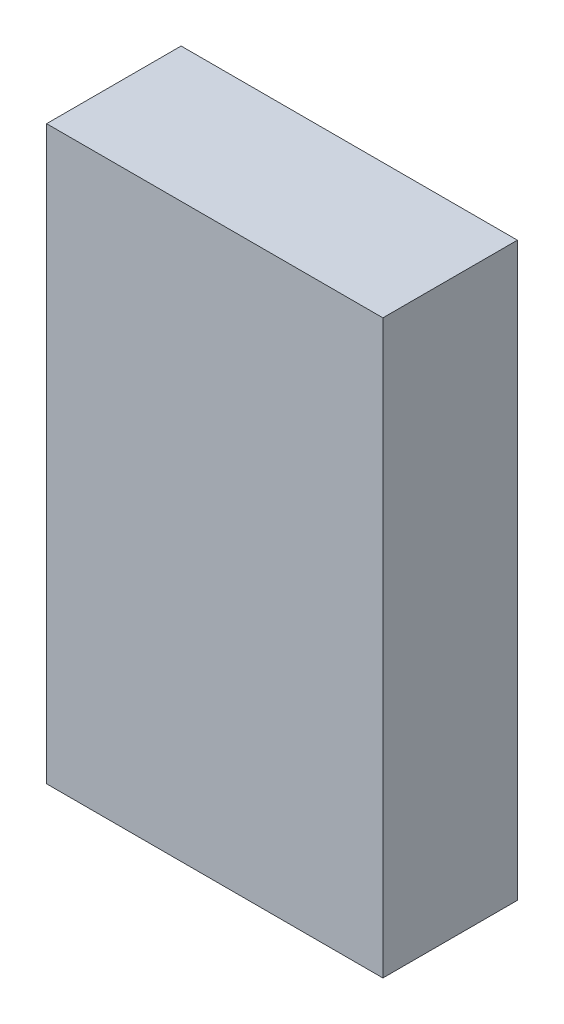
ISO-10303-21;
HEADER;
FILE_DESCRIPTION(('STEP AP214'),'2;1');
FILE_NAME('part.step','',(''),(''),'','','');
FILE_SCHEMA(('AUTOMOTIVE_DESIGN { 1 0 10303 214 1 1 1 1 }'));
ENDSEC;
DATA;
#1=APPLICATION_CONTEXT('core data for automotive mechanical design processes');
#2=APPLICATION_PROTOCOL_DEFINITION('international standard','automotive_design',2000,#1);
#3=PRODUCT_CONTEXT('',#1,'mechanical');
#4=PRODUCT('Part','Part','',(#3));
#5=PRODUCT_RELATED_PRODUCT_CATEGORY('part','',(#4));
#6=PRODUCT_DEFINITION_FORMATION('','',#4);
#7=PRODUCT_DEFINITION_CONTEXT('part definition',#1,'design');
#8=PRODUCT_DEFINITION('design','',#6,#7);
#9=PRODUCT_DEFINITION_SHAPE('','',#8);
#10=(LENGTH_UNIT() NAMED_UNIT(*) SI_UNIT(.MILLI.,.METRE.));
#11=(NAMED_UNIT(*) PLANE_ANGLE_UNIT() SI_UNIT($,.RADIAN.));
#12=(NAMED_UNIT(*) SI_UNIT($,.STERADIAN.) SOLID_ANGLE_UNIT());
#13=UNCERTAINTY_MEASURE_WITH_UNIT(LENGTH_MEASURE(1.E-05),#10,'distance_accuracy_value','');
#14=(GEOMETRIC_REPRESENTATION_CONTEXT(3) GLOBAL_UNCERTAINTY_ASSIGNED_CONTEXT((#13)) GLOBAL_UNIT_ASSIGNED_CONTEXT((#10,
#11,#12)) REPRESENTATION_CONTEXT('',''));
#15=CARTESIAN_POINT('',(0.,0.,0.));
#16=DIRECTION('',(0.,0.,1.));
#17=DIRECTION('',(1.,0.,0.));
#18=AXIS2_PLACEMENT_3D('',#15,#16,#17);
#19=CARTESIAN_POINT('',(-25.4,86.36,-10.16));
#20=DIRECTION('',(1.,0.,0.));
#21=DIRECTION('',(0.,0.,-1.));
#22=AXIS2_PLACEMENT_3D('',#19,#20,#21);
#23=PLANE('',#22);
#24=DIRECTION('',(0.,0.,1.));
#25=VECTOR('',#24,1.);
#26=CARTESIAN_POINT('',(-25.4,0.,-10.16));
#27=LINE('',#26,#25);
#28=CARTESIAN_POINT('',(-25.4,0.,-10.16));
#29=VERTEX_POINT('',#28);
#30=CARTESIAN_POINT('',(-25.4,0.,10.16));
#31=VERTEX_POINT('',#30);
#32=EDGE_CURVE('E113',#29,#31,#27,.T.);
#33=ORIENTED_EDGE('',*,*,#32,.T.);
#34=DIRECTION('',(0.,-1.,0.));
#35=VECTOR('',#34,1.);
#36=CARTESIAN_POINT('',(-25.4,86.36,10.16));
#37=LINE('',#36,#35);
#38=CARTESIAN_POINT('',(-25.4,86.36,10.16));
#39=VERTEX_POINT('',#38);
#40=EDGE_CURVE('E11',#39,#31,#37,.T.);
#41=ORIENTED_EDGE('',*,*,#40,.F.);
#42=DIRECTION('',(0.,0.,1.));
#43=VECTOR('',#42,1.);
#44=CARTESIAN_POINT('',(-25.4,86.36,-10.16));
#45=LINE('',#44,#43);
#46=CARTESIAN_POINT('',(-25.4,86.36,-10.16));
#47=VERTEX_POINT('',#46);
#48=EDGE_CURVE('E95',#47,#39,#45,.T.);
#49=ORIENTED_EDGE('',*,*,#48,.F.);
#50=DIRECTION('',(0.,-1.,0.));
#51=VECTOR('',#50,1.);
#52=CARTESIAN_POINT('',(-25.4,86.36,-10.16));
#53=LINE('',#52,#51);
#54=EDGE_CURVE('E62',#47,#29,#53,.T.);
#55=ORIENTED_EDGE('',*,*,#54,.T.);
#56=EDGE_LOOP('',(#33,#41,#49,#55));
#57=FACE_BOUND('',#56,.T.);
#58=ADVANCED_FACE('F45',(#57),#23,.F.);
#59=CARTESIAN_POINT('',(-25.4,86.36,10.16));
#60=DIRECTION('',(0.,0.,-1.));
#61=DIRECTION('',(-1.,0.,0.));
#62=AXIS2_PLACEMENT_3D('',#59,#60,#61);
#63=PLANE('',#62);
#64=DIRECTION('',(1.,0.,0.));
#65=VECTOR('',#64,1.);
#66=CARTESIAN_POINT('',(-25.4,0.,10.16));
#67=LINE('',#66,#65);
#68=CARTESIAN_POINT('',(25.4,0.,10.16));
#69=VERTEX_POINT('',#68);
#70=EDGE_CURVE('E101',#31,#69,#67,.T.);
#71=ORIENTED_EDGE('',*,*,#70,.T.);
#72=DIRECTION('',(0.,-1.,0.));
#73=VECTOR('',#72,1.);
#74=CARTESIAN_POINT('',(25.4,86.36,10.16));
#75=LINE('',#74,#73);
#76=CARTESIAN_POINT('',(25.4,86.36,10.16));
#77=VERTEX_POINT('',#76);
#78=EDGE_CURVE('E54',#77,#69,#75,.T.);
#79=ORIENTED_EDGE('',*,*,#78,.F.);
#80=DIRECTION('',(1.,0.,0.));
#81=VECTOR('',#80,1.);
#82=CARTESIAN_POINT('',(-25.4,86.36,10.16));
#83=LINE('',#82,#81);
#84=EDGE_CURVE('E87',#39,#77,#83,.T.);
#85=ORIENTED_EDGE('',*,*,#84,.F.);
#86=ORIENTED_EDGE('',*,*,#40,.T.);
#87=EDGE_LOOP('',(#71,#79,#85,#86));
#88=FACE_BOUND('',#87,.T.);
#89=ADVANCED_FACE('F100',(#88),#63,.F.);
#90=CARTESIAN_POINT('',(25.4,86.36,-10.16));
#91=DIRECTION('',(1.,0.,0.));
#92=DIRECTION('',(0.,0.,-1.));
#93=AXIS2_PLACEMENT_3D('',#90,#91,#92);
#94=PLANE('',#93);
#95=DIRECTION('',(0.,0.,1.));
#96=VECTOR('',#95,1.);
#97=CARTESIAN_POINT('',(25.4,0.,-10.16));
#98=LINE('',#97,#96);
#99=CARTESIAN_POINT('',(25.4,0.,-10.16));
#100=VERTEX_POINT('',#99);
#101=EDGE_CURVE('E118',#100,#69,#98,.T.);
#102=ORIENTED_EDGE('',*,*,#101,.F.);
#103=DIRECTION('',(0.,-1.,0.));
#104=VECTOR('',#103,1.);
#105=CARTESIAN_POINT('',(25.4,86.36,-10.16));
#106=LINE('',#105,#104);
#107=CARTESIAN_POINT('',(25.4,86.36,-10.16));
#108=VERTEX_POINT('',#107);
#109=EDGE_CURVE('E76',#108,#100,#106,.T.);
#110=ORIENTED_EDGE('',*,*,#109,.F.);
#111=DIRECTION('',(0.,0.,1.));
#112=VECTOR('',#111,1.);
#113=CARTESIAN_POINT('',(25.4,86.36,-10.16));
#114=LINE('',#113,#112);
#115=EDGE_CURVE('E94',#108,#77,#114,.T.);
#116=ORIENTED_EDGE('',*,*,#115,.T.);
#117=ORIENTED_EDGE('',*,*,#78,.T.);
#118=EDGE_LOOP('',(#102,#110,#116,#117));
#119=FACE_BOUND('',#118,.T.);
#120=ADVANCED_FACE('F105',(#119),#94,.T.);
#121=CARTESIAN_POINT('',(-25.4,86.36,-10.16));
#122=DIRECTION('',(0.,0.,-1.));
#123=DIRECTION('',(-1.,0.,0.));
#124=AXIS2_PLACEMENT_3D('',#121,#122,#123);
#125=PLANE('',#124);
#126=DIRECTION('',(1.,0.,0.));
#127=VECTOR('',#126,1.);
#128=CARTESIAN_POINT('',(-25.4,0.,-10.16));
#129=LINE('',#128,#127);
#130=EDGE_CURVE('E121',#29,#100,#129,.T.);
#131=ORIENTED_EDGE('',*,*,#130,.F.);
#132=ORIENTED_EDGE('',*,*,#54,.F.);
#133=DIRECTION('',(1.,0.,0.));
#134=VECTOR('',#133,1.);
#135=CARTESIAN_POINT('',(-25.4,86.36,-10.16));
#136=LINE('',#135,#134);
#137=EDGE_CURVE('E107',#47,#108,#136,.T.);
#138=ORIENTED_EDGE('',*,*,#137,.T.);
#139=ORIENTED_EDGE('',*,*,#109,.T.);
#140=EDGE_LOOP('',(#131,#132,#138,#139));
#141=FACE_BOUND('',#140,.T.);
#142=ADVANCED_FACE('F131',(#141),#125,.T.);
#143=CARTESIAN_POINT('',(0.,86.36,0.));
#144=DIRECTION('',(0.,1.,0.));
#145=DIRECTION('',(0.,0.,1.));
#146=AXIS2_PLACEMENT_3D('',#143,#144,#145);
#147=PLANE('',#146);
#148=ORIENTED_EDGE('',*,*,#48,.T.);
#149=ORIENTED_EDGE('',*,*,#84,.T.);
#150=ORIENTED_EDGE('',*,*,#115,.F.);
#151=ORIENTED_EDGE('',*,*,#137,.F.);
#152=EDGE_LOOP('',(#148,#149,#150,#151));
#153=FACE_BOUND('',#152,.T.);
#154=ADVANCED_FACE('F91',(#153),#147,.T.);
#155=CARTESIAN_POINT('',(0.,0.,0.));
#156=DIRECTION('',(0.,1.,0.));
#157=DIRECTION('',(0.,0.,1.));
#158=AXIS2_PLACEMENT_3D('',#155,#156,#157);
#159=PLANE('',#158);
#160=ORIENTED_EDGE('',*,*,#32,.F.);
#161=ORIENTED_EDGE('',*,*,#130,.T.);
#162=ORIENTED_EDGE('',*,*,#101,.T.);
#163=ORIENTED_EDGE('',*,*,#70,.F.);
#164=EDGE_LOOP('',(#160,#161,#162,#163));
#165=FACE_BOUND('',#164,.T.);
#166=ADVANCED_FACE('F130',(#165),#159,.F.);
#167=CLOSED_SHELL('',(#58,#89,#120,#142,#154,#166));
#168=MANIFOLD_SOLID_BREP('B2',#167);
#169=ADVANCED_BREP_SHAPE_REPRESENTATION('',(#18,#168),#14);
#170=SHAPE_DEFINITION_REPRESENTATION(#9,#169);
ENDSEC;
END-ISO-10303-21;
